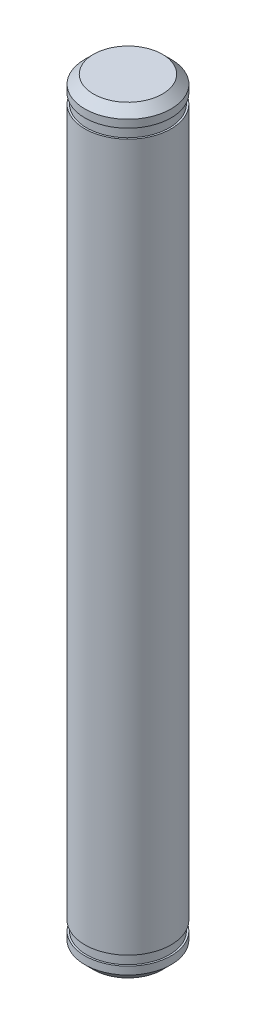
ISO-10303-21;
HEADER;
FILE_DESCRIPTION(('STEP AP214'),'2;1');
FILE_NAME('part.step','',(''),(''),'','','');
FILE_SCHEMA(('AUTOMOTIVE_DESIGN { 1 0 10303 214 1 1 1 1 }'));
ENDSEC;
DATA;
#1=APPLICATION_CONTEXT('core data for automotive mechanical design processes');
#2=APPLICATION_PROTOCOL_DEFINITION('international standard','automotive_design',2000,#1);
#3=PRODUCT_CONTEXT('',#1,'mechanical');
#4=PRODUCT('Part','Part','',(#3));
#5=PRODUCT_RELATED_PRODUCT_CATEGORY('part','',(#4));
#6=PRODUCT_DEFINITION_FORMATION('','',#4);
#7=PRODUCT_DEFINITION_CONTEXT('part definition',#1,'design');
#8=PRODUCT_DEFINITION('design','',#6,#7);
#9=PRODUCT_DEFINITION_SHAPE('','',#8);
#10=(LENGTH_UNIT() NAMED_UNIT(*) SI_UNIT(.MILLI.,.METRE.));
#11=(NAMED_UNIT(*) PLANE_ANGLE_UNIT() SI_UNIT($,.RADIAN.));
#12=(NAMED_UNIT(*) SI_UNIT($,.STERADIAN.) SOLID_ANGLE_UNIT());
#13=UNCERTAINTY_MEASURE_WITH_UNIT(LENGTH_MEASURE(1.E-05),#10,'distance_accuracy_value','');
#14=(GEOMETRIC_REPRESENTATION_CONTEXT(3) GLOBAL_UNCERTAINTY_ASSIGNED_CONTEXT((#13)) GLOBAL_UNIT_ASSIGNED_CONTEXT((#10,
#11,#12)) REPRESENTATION_CONTEXT('',''));
#15=CARTESIAN_POINT('',(0.,0.,0.));
#16=DIRECTION('',(0.,0.,1.));
#17=DIRECTION('',(1.,0.,0.));
#18=AXIS2_PLACEMENT_3D('',#15,#16,#17);
#19=CARTESIAN_POINT('',(0.,44.,0.));
#20=DIRECTION('',(0.,1.,0.));
#21=DIRECTION('',(-1.,0.,0.));
#22=AXIS2_PLACEMENT_3D('',#19,#20,#21);
#23=CYLINDRICAL_SURFACE('',#22,5.);
#24=CARTESIAN_POINT('',(0.,41.,0.));
#25=DIRECTION('',(0.,1.,0.));
#26=DIRECTION('',(-1.,0.,0.));
#27=AXIS2_PLACEMENT_3D('',#24,#25,#26);
#28=CIRCLE('',#27,5.);
#29=CARTESIAN_POINT('',(-4.99999999999999,41.,0.));
#30=VERTEX_POINT('',#29);
#31=EDGE_CURVE('E59',#30,#30,#28,.T.);
#32=ORIENTED_EDGE('',*,*,#31,.F.);
#33=EDGE_LOOP('',(#32));
#34=FACE_BOUND('',#33,.T.);
#35=CARTESIAN_POINT('',(0.,-41.,0.));
#36=DIRECTION('',(0.,1.,0.));
#37=DIRECTION('',(-1.,0.,0.));
#38=AXIS2_PLACEMENT_3D('',#35,#36,#37);
#39=CIRCLE('',#38,5.);
#40=CARTESIAN_POINT('',(-4.99999999999998,-41.,0.));
#41=VERTEX_POINT('',#40);
#42=EDGE_CURVE('E71',#41,#41,#39,.T.);
#43=ORIENTED_EDGE('',*,*,#42,.T.);
#44=EDGE_LOOP('',(#43));
#45=FACE_BOUND('',#44,.T.);
#46=ADVANCED_FACE('F37',(#34,#45),#23,.T.);
#47=CARTESIAN_POINT('',(0.,44.,0.));
#48=DIRECTION('',(0.,-1.,0.));
#49=DIRECTION('',(1.,0.,0.));
#50=AXIS2_PLACEMENT_3D('',#47,#48,#49);
#51=PLANE('',#50);
#52=CARTESIAN_POINT('',(0.,44.,0.));
#53=DIRECTION('',(0.,-1.,0.));
#54=DIRECTION('',(1.,0.,0.));
#55=AXIS2_PLACEMENT_3D('',#52,#53,#54);
#56=CIRCLE('',#55,4.00000000000002);
#57=CARTESIAN_POINT('',(4.00000000000002,44.,0.));
#58=VERTEX_POINT('',#57);
#59=EDGE_CURVE('E10',#58,#58,#56,.F.);
#60=ORIENTED_EDGE('',*,*,#59,.T.);
#61=EDGE_LOOP('',(#60));
#62=FACE_BOUND('',#61,.T.);
#63=ADVANCED_FACE('F112',(#62),#51,.F.);
#64=CARTESIAN_POINT('',(0.,42.1,0.));
#65=DIRECTION('',(0.,1.,0.));
#66=DIRECTION('',(-1.,0.,0.));
#67=AXIS2_PLACEMENT_3D('',#64,#65,#66);
#68=CIRCLE('',#67,5.);
#69=CARTESIAN_POINT('',(-4.99999999999999,42.1,0.));
#70=VERTEX_POINT('',#69);
#71=EDGE_CURVE('E58',#70,#70,#68,.T.);
#72=ORIENTED_EDGE('',*,*,#71,.T.);
#73=EDGE_LOOP('',(#72));
#74=FACE_BOUND('',#73,.T.);
#75=CARTESIAN_POINT('',(0.,43.,0.));
#76=DIRECTION('',(0.,-1.,0.));
#77=DIRECTION('',(1.,0.,0.));
#78=AXIS2_PLACEMENT_3D('',#75,#76,#77);
#79=CIRCLE('',#78,5.);
#80=CARTESIAN_POINT('',(5.,43.,0.));
#81=VERTEX_POINT('',#80);
#82=EDGE_CURVE('E53',#81,#81,#79,.T.);
#83=ORIENTED_EDGE('',*,*,#82,.T.);
#84=EDGE_LOOP('',(#83));
#85=FACE_BOUND('',#84,.T.);
#86=ADVANCED_FACE('F99',(#74,#85),#23,.T.);
#87=CARTESIAN_POINT('',(0.,44.,0.));
#88=DIRECTION('',(0.,-1.,0.));
#89=DIRECTION('',(1.,0.,0.));
#90=AXIS2_PLACEMENT_3D('',#87,#88,#89);
#91=CONICAL_SURFACE('',#90,4.00000000000002,0.785398163397451);
#92=ORIENTED_EDGE('',*,*,#82,.F.);
#93=EDGE_LOOP('',(#92));
#94=FACE_BOUND('',#93,.T.);
#95=ORIENTED_EDGE('',*,*,#59,.F.);
#96=EDGE_LOOP('',(#95));
#97=FACE_BOUND('',#96,.T.);
#98=ADVANCED_FACE('F40',(#94,#97),#91,.T.);
#99=CARTESIAN_POINT('',(0.,42.1,0.));
#100=DIRECTION('',(0.,1.,0.));
#101=DIRECTION('',(-1.,0.,0.));
#102=AXIS2_PLACEMENT_3D('',#99,#100,#101);
#103=PLANE('',#102);
#104=ORIENTED_EDGE('',*,*,#71,.F.);
#105=EDGE_LOOP('',(#104));
#106=FACE_BOUND('',#105,.T.);
#107=CARTESIAN_POINT('',(0.,42.1,0.));
#108=DIRECTION('',(0.,1.,0.));
#109=DIRECTION('',(-1.,0.,0.));
#110=AXIS2_PLACEMENT_3D('',#107,#108,#109);
#111=CIRCLE('',#110,4.8);
#112=CARTESIAN_POINT('',(-4.8,42.1,0.));
#113=VERTEX_POINT('',#112);
#114=EDGE_CURVE('E62',#113,#113,#111,.T.);
#115=ORIENTED_EDGE('',*,*,#114,.T.);
#116=EDGE_LOOP('',(#115));
#117=FACE_BOUND('',#116,.T.);
#118=ADVANCED_FACE('F124',(#106,#117),#103,.F.);
#119=CARTESIAN_POINT('',(0.,41.,0.));
#120=DIRECTION('',(0.,1.,0.));
#121=DIRECTION('',(-1.,0.,0.));
#122=AXIS2_PLACEMENT_3D('',#119,#120,#121);
#123=PLANE('',#122);
#124=ORIENTED_EDGE('',*,*,#31,.T.);
#125=EDGE_LOOP('',(#124));
#126=FACE_BOUND('',#125,.T.);
#127=CARTESIAN_POINT('',(0.,41.,0.));
#128=DIRECTION('',(0.,1.,0.));
#129=DIRECTION('',(-1.,0.,0.));
#130=AXIS2_PLACEMENT_3D('',#127,#128,#129);
#131=CIRCLE('',#130,4.8);
#132=CARTESIAN_POINT('',(-4.8,41.,0.));
#133=VERTEX_POINT('',#132);
#134=EDGE_CURVE('E65',#133,#133,#131,.T.);
#135=ORIENTED_EDGE('',*,*,#134,.F.);
#136=EDGE_LOOP('',(#135));
#137=FACE_BOUND('',#136,.T.);
#138=ADVANCED_FACE('F133',(#126,#137),#123,.T.);
#139=CARTESIAN_POINT('',(0.,42.1,0.));
#140=DIRECTION('',(0.,-1.,0.));
#141=DIRECTION('',(1.,0.,0.));
#142=AXIS2_PLACEMENT_3D('',#139,#140,#141);
#143=CYLINDRICAL_SURFACE('',#142,4.8);
#144=ORIENTED_EDGE('',*,*,#114,.F.);
#145=EDGE_LOOP('',(#144));
#146=FACE_BOUND('',#145,.T.);
#147=ORIENTED_EDGE('',*,*,#134,.T.);
#148=EDGE_LOOP('',(#147));
#149=FACE_BOUND('',#148,.T.);
#150=ADVANCED_FACE('F90',(#146,#149),#143,.T.);
#151=CARTESIAN_POINT('',(0.,-42.1,0.));
#152=DIRECTION('',(0.,-1.,0.));
#153=DIRECTION('',(-1.,0.,0.));
#154=AXIS2_PLACEMENT_3D('',#151,#152,#153);
#155=PLANE('',#154);
#156=CARTESIAN_POINT('',(0.,-42.1,0.));
#157=DIRECTION('',(0.,1.,0.));
#158=DIRECTION('',(-1.,0.,0.));
#159=AXIS2_PLACEMENT_3D('',#156,#157,#158);
#160=CIRCLE('',#159,4.8);
#161=CARTESIAN_POINT('',(-4.79999999999999,-42.1,0.));
#162=VERTEX_POINT('',#161);
#163=EDGE_CURVE('E74',#162,#162,#160,.T.);
#164=ORIENTED_EDGE('',*,*,#163,.F.);
#165=EDGE_LOOP('',(#164));
#166=FACE_BOUND('',#165,.T.);
#167=CARTESIAN_POINT('',(0.,-42.1,0.));
#168=DIRECTION('',(0.,1.,0.));
#169=DIRECTION('',(-1.,0.,0.));
#170=AXIS2_PLACEMENT_3D('',#167,#168,#169);
#171=CIRCLE('',#170,5.);
#172=CARTESIAN_POINT('',(-4.99999999999998,-42.1,0.));
#173=VERTEX_POINT('',#172);
#174=EDGE_CURVE('E68',#173,#173,#171,.T.);
#175=ORIENTED_EDGE('',*,*,#174,.T.);
#176=EDGE_LOOP('',(#175));
#177=FACE_BOUND('',#176,.T.);
#178=ADVANCED_FACE('F86',(#166,#177),#155,.F.);
#179=CARTESIAN_POINT('',(0.,-41.,0.));
#180=DIRECTION('',(0.,-1.,0.));
#181=DIRECTION('',(-1.,0.,0.));
#182=AXIS2_PLACEMENT_3D('',#179,#180,#181);
#183=PLANE('',#182);
#184=CARTESIAN_POINT('',(0.,-41.,0.));
#185=DIRECTION('',(0.,1.,0.));
#186=DIRECTION('',(-1.,0.,0.));
#187=AXIS2_PLACEMENT_3D('',#184,#185,#186);
#188=CIRCLE('',#187,4.8);
#189=CARTESIAN_POINT('',(-4.79999999999999,-41.,0.));
#190=VERTEX_POINT('',#189);
#191=EDGE_CURVE('E77',#190,#190,#188,.T.);
#192=ORIENTED_EDGE('',*,*,#191,.T.);
#193=EDGE_LOOP('',(#192));
#194=FACE_BOUND('',#193,.T.);
#195=ORIENTED_EDGE('',*,*,#42,.F.);
#196=EDGE_LOOP('',(#195));
#197=FACE_BOUND('',#196,.T.);
#198=ADVANCED_FACE('F89',(#194,#197),#183,.T.);
#199=CARTESIAN_POINT('',(0.,-42.1,0.));
#200=DIRECTION('',(0.,1.,0.));
#201=DIRECTION('',(-1.,0.,0.));
#202=AXIS2_PLACEMENT_3D('',#199,#200,#201);
#203=CYLINDRICAL_SURFACE('',#202,4.8);
#204=ORIENTED_EDGE('',*,*,#163,.T.);
#205=EDGE_LOOP('',(#204));
#206=FACE_BOUND('',#205,.T.);
#207=ORIENTED_EDGE('',*,*,#191,.F.);
#208=EDGE_LOOP('',(#207));
#209=FACE_BOUND('',#208,.T.);
#210=ADVANCED_FACE('F83',(#206,#209),#203,.T.);
#211=CARTESIAN_POINT('',(5.,-44.,0.));
#212=DIRECTION('',(0.,1.,0.));
#213=DIRECTION('',(-1.,0.,0.));
#214=AXIS2_PLACEMENT_3D('',#211,#212,#213);
#215=PLANE('',#214);
#216=CARTESIAN_POINT('',(0.,-44.,0.));
#217=DIRECTION('',(0.,1.,0.));
#218=DIRECTION('',(-1.,0.,0.));
#219=AXIS2_PLACEMENT_3D('',#216,#217,#218);
#220=CIRCLE('',#219,3.99999999999997);
#221=CARTESIAN_POINT('',(-3.99999999999995,-44.,0.));
#222=VERTEX_POINT('',#221);
#223=EDGE_CURVE('E45',#222,#222,#220,.F.);
#224=ORIENTED_EDGE('',*,*,#223,.T.);
#225=EDGE_LOOP('',(#224));
#226=FACE_BOUND('',#225,.T.);
#227=ADVANCED_FACE('F103',(#226),#215,.F.);
#228=CARTESIAN_POINT('',(0.,-43.,0.));
#229=DIRECTION('',(0.,1.,0.));
#230=DIRECTION('',(-1.,0.,0.));
#231=AXIS2_PLACEMENT_3D('',#228,#229,#230);
#232=CONICAL_SURFACE('',#231,5.,0.785398163397455);
#233=ORIENTED_EDGE('',*,*,#223,.F.);
#234=EDGE_LOOP('',(#233));
#235=FACE_BOUND('',#234,.T.);
#236=CARTESIAN_POINT('',(0.,-43.,0.));
#237=DIRECTION('',(0.,1.,0.));
#238=DIRECTION('',(-1.,0.,0.));
#239=AXIS2_PLACEMENT_3D('',#236,#237,#238);
#240=CIRCLE('',#239,5.);
#241=CARTESIAN_POINT('',(-4.99999999999998,-43.,0.));
#242=VERTEX_POINT('',#241);
#243=EDGE_CURVE('E49',#242,#242,#240,.T.);
#244=ORIENTED_EDGE('',*,*,#243,.F.);
#245=EDGE_LOOP('',(#244));
#246=FACE_BOUND('',#245,.T.);
#247=ADVANCED_FACE('F97',(#235,#246),#232,.T.);
#248=ORIENTED_EDGE('',*,*,#174,.F.);
#249=EDGE_LOOP('',(#248));
#250=FACE_BOUND('',#249,.T.);
#251=ORIENTED_EDGE('',*,*,#243,.T.);
#252=EDGE_LOOP('',(#251));
#253=FACE_BOUND('',#252,.T.);
#254=ADVANCED_FACE('F94',(#250,#253),#23,.T.);
#255=CLOSED_SHELL('',(#46,#63,#86,#98,#118,#138,#150,#178,#198,#210,#227,#247,#254));
#256=MANIFOLD_SOLID_BREP('B2',#255);
#257=ADVANCED_BREP_SHAPE_REPRESENTATION('',(#18,#256),#14);
#258=SHAPE_DEFINITION_REPRESENTATION(#9,#257);
ENDSEC;
END-ISO-10303-21;
